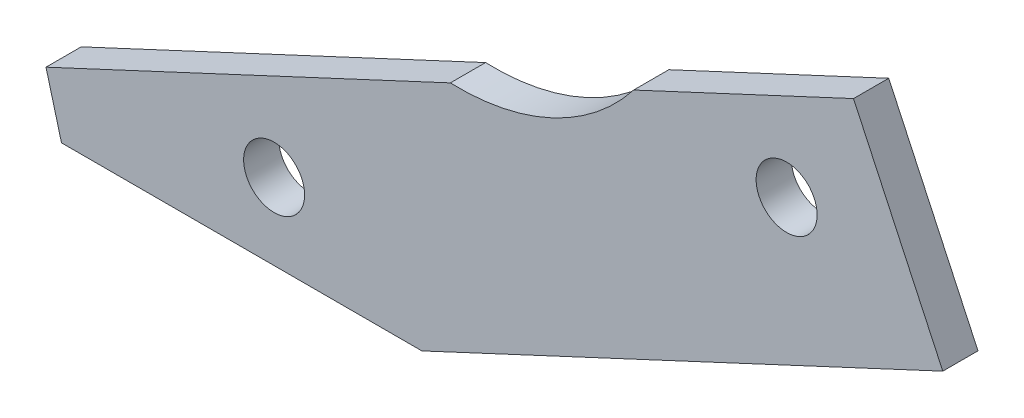
ISO-10303-21;
HEADER;
FILE_DESCRIPTION(('STEP AP214'),'2;1');
FILE_NAME('part.step','',(''),(''),'','','');
FILE_SCHEMA(('AUTOMOTIVE_DESIGN { 1 0 10303 214 1 1 1 1 }'));
ENDSEC;
DATA;
#1=APPLICATION_CONTEXT('core data for automotive mechanical design processes');
#2=APPLICATION_PROTOCOL_DEFINITION('international standard','automotive_design',2000,#1);
#3=PRODUCT_CONTEXT('',#1,'mechanical');
#4=PRODUCT('Part','Part','',(#3));
#5=PRODUCT_RELATED_PRODUCT_CATEGORY('part','',(#4));
#6=PRODUCT_DEFINITION_FORMATION('','',#4);
#7=PRODUCT_DEFINITION_CONTEXT('part definition',#1,'design');
#8=PRODUCT_DEFINITION('design','',#6,#7);
#9=PRODUCT_DEFINITION_SHAPE('','',#8);
#10=(LENGTH_UNIT() NAMED_UNIT(*) SI_UNIT(.MILLI.,.METRE.));
#11=(NAMED_UNIT(*) PLANE_ANGLE_UNIT() SI_UNIT($,.RADIAN.));
#12=(NAMED_UNIT(*) SI_UNIT($,.STERADIAN.) SOLID_ANGLE_UNIT());
#13=UNCERTAINTY_MEASURE_WITH_UNIT(LENGTH_MEASURE(1.E-05),#10,'distance_accuracy_value','');
#14=(GEOMETRIC_REPRESENTATION_CONTEXT(3) GLOBAL_UNCERTAINTY_ASSIGNED_CONTEXT((#13)) GLOBAL_UNIT_ASSIGNED_CONTEXT((#10,
#11,#12)) REPRESENTATION_CONTEXT('',''));
#15=CARTESIAN_POINT('',(0.,0.,0.));
#16=DIRECTION('',(0.,0.,1.));
#17=DIRECTION('',(1.,0.,0.));
#18=AXIS2_PLACEMENT_3D('',#15,#16,#17);
#19=CARTESIAN_POINT('',(-143.336488127854,145.681801447303,-3.175));
#20=DIRECTION('',(0.90630778703665,0.4226182617407,0.));
#21=DIRECTION('',(-0.4226182617407,0.90630778703665,0.));
#22=AXIS2_PLACEMENT_3D('',#19,#20,#21);
#23=PLANE('',#22);
#24=DIRECTION('',(-0.4226182617407,0.90630778703665,0.));
#25=VECTOR('',#24,1.);
#26=CARTESIAN_POINT('',(-143.336488127854,145.681801447303,0.));
#27=LINE('',#26,#25);
#28=CARTESIAN_POINT('',(-143.336488127854,145.681801447303,0.));
#29=VERTEX_POINT('',#28);
#30=CARTESIAN_POINT('',(-151.387366014014,162.946964790352,0.));
#31=VERTEX_POINT('',#30);
#32=EDGE_CURVE('E132',#29,#31,#27,.T.);
#33=ORIENTED_EDGE('',*,*,#32,.F.);
#34=DIRECTION('',(0.,0.,1.));
#35=VECTOR('',#34,1.);
#36=CARTESIAN_POINT('',(-143.336488127854,145.681801447303,-3.175));
#37=LINE('',#36,#35);
#38=CARTESIAN_POINT('',(-143.336488127854,145.681801447303,-3.175));
#39=VERTEX_POINT('',#38);
#40=EDGE_CURVE('E11',#39,#29,#37,.T.);
#41=ORIENTED_EDGE('',*,*,#40,.F.);
#42=DIRECTION('',(-0.4226182617407,0.90630778703665,0.));
#43=VECTOR('',#42,1.);
#44=CARTESIAN_POINT('',(-143.336488127854,145.681801447303,-3.175));
#45=LINE('',#44,#43);
#46=CARTESIAN_POINT('',(-151.387366014014,162.946964790352,-3.175));
#47=VERTEX_POINT('',#46);
#48=EDGE_CURVE('E150',#39,#47,#45,.T.);
#49=ORIENTED_EDGE('',*,*,#48,.T.);
#50=DIRECTION('',(0.,0.,1.));
#51=VECTOR('',#50,1.);
#52=CARTESIAN_POINT('',(-151.387366014014,162.946964790352,-3.175));
#53=LINE('',#52,#51);
#54=EDGE_CURVE('E44',#47,#31,#53,.T.);
#55=ORIENTED_EDGE('',*,*,#54,.T.);
#56=EDGE_LOOP('',(#33,#41,#49,#55));
#57=FACE_BOUND('',#56,.T.);
#58=ADVANCED_FACE('F41',(#57),#23,.T.);
#59=CARTESIAN_POINT('',(-190.317469649379,123.774209976178,-3.175));
#60=DIRECTION('',(0.4226182617407,-0.90630778703665,0.));
#61=DIRECTION('',(0.90630778703665,0.4226182617407,0.));
#62=AXIS2_PLACEMENT_3D('',#59,#60,#61);
#63=PLANE('',#62);
#64=DIRECTION('',(0.90630778703665,0.4226182617407,0.));
#65=VECTOR('',#64,1.);
#66=CARTESIAN_POINT('',(-190.317469649379,123.774209976178,0.));
#67=LINE('',#66,#65);
#68=CARTESIAN_POINT('',(-190.317469649379,123.774209976178,0.));
#69=VERTEX_POINT('',#68);
#70=EDGE_CURVE('E148',#69,#29,#67,.T.);
#71=ORIENTED_EDGE('',*,*,#70,.F.);
#72=DIRECTION('',(0.,0.,1.));
#73=VECTOR('',#72,1.);
#74=CARTESIAN_POINT('',(-190.317469649379,123.774209976178,-3.175));
#75=LINE('',#74,#73);
#76=CARTESIAN_POINT('',(-190.317469649379,123.774209976178,-3.175));
#77=VERTEX_POINT('',#76);
#78=EDGE_CURVE('E50',#77,#69,#75,.T.);
#79=ORIENTED_EDGE('',*,*,#78,.F.);
#80=DIRECTION('',(0.90630778703665,0.4226182617407,0.));
#81=VECTOR('',#80,1.);
#82=CARTESIAN_POINT('',(-190.317469649379,123.774209976178,-3.175));
#83=LINE('',#82,#81);
#84=EDGE_CURVE('E122',#77,#39,#83,.T.);
#85=ORIENTED_EDGE('',*,*,#84,.T.);
#86=ORIENTED_EDGE('',*,*,#40,.T.);
#87=EDGE_LOOP('',(#71,#79,#85,#86));
#88=FACE_BOUND('',#87,.T.);
#89=ADVANCED_FACE('F160',(#88),#63,.T.);
#90=CARTESIAN_POINT('',(-222.816572263279,123.774209976178,-3.175));
#91=DIRECTION('',(0.,-1.,0.));
#92=DIRECTION('',(0.,0.,-1.));
#93=AXIS2_PLACEMENT_3D('',#90,#91,#92);
#94=PLANE('',#93);
#95=DIRECTION('',(1.,0.,0.));
#96=VECTOR('',#95,1.);
#97=CARTESIAN_POINT('',(-222.816572263279,123.774209976178,0.));
#98=LINE('',#97,#96);
#99=CARTESIAN_POINT('',(-222.816572263279,123.774209976178,0.));
#100=VERTEX_POINT('',#99);
#101=EDGE_CURVE('E109',#100,#69,#98,.T.);
#102=ORIENTED_EDGE('',*,*,#101,.F.);
#103=DIRECTION('',(0.,0.,1.));
#104=VECTOR('',#103,1.);
#105=CARTESIAN_POINT('',(-222.816572263279,123.774209976178,-3.175));
#106=LINE('',#105,#104);
#107=CARTESIAN_POINT('',(-222.816572263279,123.774209976178,-3.175));
#108=VERTEX_POINT('',#107);
#109=EDGE_CURVE('E104',#108,#100,#106,.T.);
#110=ORIENTED_EDGE('',*,*,#109,.F.);
#111=DIRECTION('',(1.,0.,0.));
#112=VECTOR('',#111,1.);
#113=CARTESIAN_POINT('',(-222.816572263279,123.774209976178,-3.175));
#114=LINE('',#113,#112);
#115=EDGE_CURVE('E107',#108,#77,#114,.T.);
#116=ORIENTED_EDGE('',*,*,#115,.T.);
#117=ORIENTED_EDGE('',*,*,#78,.T.);
#118=EDGE_LOOP('',(#102,#110,#116,#117));
#119=FACE_BOUND('',#118,.T.);
#120=ADVANCED_FACE('F106',(#119),#94,.T.);
#121=CARTESIAN_POINT('',(-224.213491790778,128.987584626888,-3.175));
#122=DIRECTION('',(-0.96592582628907,-0.258819045102514,0.));
#123=DIRECTION('',(0.258819045102514,-0.96592582628907,0.));
#124=AXIS2_PLACEMENT_3D('',#121,#122,#123);
#125=PLANE('',#124);
#126=DIRECTION('',(0.258819045102514,-0.96592582628907,0.));
#127=VECTOR('',#126,1.);
#128=CARTESIAN_POINT('',(-224.213491790778,128.987584626888,0.));
#129=LINE('',#128,#127);
#130=CARTESIAN_POINT('',(-224.213491790778,128.987584626888,0.));
#131=VERTEX_POINT('',#130);
#132=EDGE_CURVE('E145',#131,#100,#129,.T.);
#133=ORIENTED_EDGE('',*,*,#132,.F.);
#134=DIRECTION('',(0.,0.,1.));
#135=VECTOR('',#134,1.);
#136=CARTESIAN_POINT('',(-224.213491790778,128.987584626888,-3.175));
#137=LINE('',#136,#135);
#138=CARTESIAN_POINT('',(-224.213491790778,128.987584626888,-3.175));
#139=VERTEX_POINT('',#138);
#140=EDGE_CURVE('E114',#139,#131,#137,.T.);
#141=ORIENTED_EDGE('',*,*,#140,.F.);
#142=DIRECTION('',(0.258819045102514,-0.96592582628907,0.));
#143=VECTOR('',#142,1.);
#144=CARTESIAN_POINT('',(-224.213491790778,128.987584626888,-3.175));
#145=LINE('',#144,#143);
#146=EDGE_CURVE('E120',#139,#108,#145,.T.);
#147=ORIENTED_EDGE('',*,*,#146,.T.);
#148=ORIENTED_EDGE('',*,*,#109,.T.);
#149=EDGE_LOOP('',(#133,#141,#147,#148));
#150=FACE_BOUND('',#149,.T.);
#151=ADVANCED_FACE('F124',(#150),#125,.T.);
#152=CARTESIAN_POINT('',(-187.747718892805,145.991853789753,-3.175));
#153=DIRECTION('',(-0.4226182617407,0.906307787036649,0.));
#154=DIRECTION('',(-0.90630778703665,-0.4226182617407,0.));
#155=AXIS2_PLACEMENT_3D('',#152,#153,#154);
#156=PLANE('',#155);
#157=DIRECTION('',(-0.906307787036649,-0.4226182617407,0.));
#158=VECTOR('',#157,1.);
#159=CARTESIAN_POINT('',(-187.747718892805,145.991853789753,0.));
#160=LINE('',#159,#158);
#161=CARTESIAN_POINT('',(-187.747718892805,145.991853789753,0.));
#162=VERTEX_POINT('',#161);
#163=EDGE_CURVE('E142',#162,#131,#160,.T.);
#164=ORIENTED_EDGE('',*,*,#163,.F.);
#165=DIRECTION('',(0.,0.,1.));
#166=VECTOR('',#165,1.);
#167=CARTESIAN_POINT('',(-187.747718892805,145.991853789753,-3.175));
#168=LINE('',#167,#166);
#169=CARTESIAN_POINT('',(-187.747718892805,145.991853789753,-3.175));
#170=VERTEX_POINT('',#169);
#171=EDGE_CURVE('E154',#170,#162,#168,.T.);
#172=ORIENTED_EDGE('',*,*,#171,.F.);
#173=DIRECTION('',(-0.906307787036649,-0.4226182617407,0.));
#174=VECTOR('',#173,1.);
#175=CARTESIAN_POINT('',(-187.747718892805,145.991853789753,-3.175));
#176=LINE('',#175,#174);
#177=EDGE_CURVE('E125',#170,#139,#176,.T.);
#178=ORIENTED_EDGE('',*,*,#177,.T.);
#179=ORIENTED_EDGE('',*,*,#140,.T.);
#180=EDGE_LOOP('',(#164,#172,#178,#179));
#181=FACE_BOUND('',#180,.T.);
#182=ADVANCED_FACE('F173',(#181),#156,.T.);
#183=CARTESIAN_POINT('',(-187.005512471135,165.978077285642,-3.175));
#184=DIRECTION('',(0.,0.,1.));
#185=DIRECTION('',(1.,0.,0.));
#186=AXIS2_PLACEMENT_3D('',#183,#184,#185);
#187=CYLINDRICAL_SURFACE('',#186,20.);
#188=CARTESIAN_POINT('',(-187.005512471135,165.978077285642,0.));
#189=DIRECTION('',(0.,0.,-1.));
#190=DIRECTION('',(-1.,0.,0.));
#191=AXIS2_PLACEMENT_3D('',#188,#189,#190);
#192=CIRCLE('',#191,20.);
#193=CARTESIAN_POINT('',(-171.218095931495,153.699743563027,0.));
#194=VERTEX_POINT('',#193);
#195=EDGE_CURVE('E139',#194,#162,#192,.T.);
#196=ORIENTED_EDGE('',*,*,#195,.F.);
#197=DIRECTION('',(0.,0.,1.));
#198=VECTOR('',#197,1.);
#199=CARTESIAN_POINT('',(-171.218095931495,153.699743563027,-3.175));
#200=LINE('',#199,#198);
#201=CARTESIAN_POINT('',(-171.218095931495,153.699743563027,-3.175));
#202=VERTEX_POINT('',#201);
#203=EDGE_CURVE('E155',#202,#194,#200,.T.);
#204=ORIENTED_EDGE('',*,*,#203,.F.);
#205=CARTESIAN_POINT('',(-187.005512471135,165.978077285642,-3.175));
#206=DIRECTION('',(0.,0.,-1.));
#207=DIRECTION('',(-1.,0.,0.));
#208=AXIS2_PLACEMENT_3D('',#205,#206,#207);
#209=CIRCLE('',#208,20.);
#210=EDGE_CURVE('E127',#202,#170,#209,.T.);
#211=ORIENTED_EDGE('',*,*,#210,.T.);
#212=ORIENTED_EDGE('',*,*,#171,.T.);
#213=EDGE_LOOP('',(#196,#204,#211,#212));
#214=FACE_BOUND('',#213,.T.);
#215=ADVANCED_FACE('F176',(#214),#187,.F.);
#216=CARTESIAN_POINT('',(-151.387366014014,162.946964790352,-3.175));
#217=DIRECTION('',(-0.422618261740699,0.90630778703665,0.));
#218=DIRECTION('',(-0.90630778703665,-0.422618261740699,0.));
#219=AXIS2_PLACEMENT_3D('',#216,#217,#218);
#220=PLANE('',#219);
#221=DIRECTION('',(-0.90630778703665,-0.422618261740699,0.));
#222=VECTOR('',#221,1.);
#223=CARTESIAN_POINT('',(-151.387366014014,162.946964790352,0.));
#224=LINE('',#223,#222);
#225=EDGE_CURVE('E135',#31,#194,#224,.T.);
#226=ORIENTED_EDGE('',*,*,#225,.F.);
#227=ORIENTED_EDGE('',*,*,#54,.F.);
#228=DIRECTION('',(-0.90630778703665,-0.422618261740699,0.));
#229=VECTOR('',#228,1.);
#230=CARTESIAN_POINT('',(-151.387366014014,162.946964790352,-3.175));
#231=LINE('',#230,#229);
#232=EDGE_CURVE('E216',#47,#202,#231,.T.);
#233=ORIENTED_EDGE('',*,*,#232,.T.);
#234=ORIENTED_EDGE('',*,*,#203,.T.);
#235=EDGE_LOOP('',(#226,#227,#233,#234));
#236=FACE_BOUND('',#235,.T.);
#237=ADVANCED_FACE('F157',(#236),#220,.T.);
#238=CARTESIAN_POINT('',(-187.005512471135,165.978077285642,-3.175));
#239=DIRECTION('',(0.,0.,-1.));
#240=DIRECTION('',(-1.,0.,0.));
#241=AXIS2_PLACEMENT_3D('',#238,#239,#240);
#242=PLANE('',#241);
#243=CARTESIAN_POINT('',(-157.419347359778,152.220574699201,-3.175));
#244=DIRECTION('',(0.,0.,1.));
#245=DIRECTION('',(1.,0.,0.));
#246=AXIS2_PLACEMENT_3D('',#243,#244,#245);
#247=CIRCLE('',#246,2.74999999999973);
#248=CARTESIAN_POINT('',(-154.669347359778,152.220574699201,-3.175));
#249=VERTEX_POINT('',#248);
#250=EDGE_CURVE('E203',#249,#249,#247,.T.);
#251=ORIENTED_EDGE('',*,*,#250,.T.);
#252=EDGE_LOOP('',(#251));
#253=FACE_BOUND('',#252,.T.);
#254=CARTESIAN_POINT('',(-203.641044498646,130.667043350425,-3.175));
#255=DIRECTION('',(0.,0.,1.));
#256=DIRECTION('',(1.,0.,0.));
#257=AXIS2_PLACEMENT_3D('',#254,#255,#256);
#258=CIRCLE('',#257,2.7499999999997);
#259=CARTESIAN_POINT('',(-200.891044498646,130.667043350425,-3.175));
#260=VERTEX_POINT('',#259);
#261=EDGE_CURVE('E136',#260,#260,#258,.T.);
#262=ORIENTED_EDGE('',*,*,#261,.T.);
#263=EDGE_LOOP('',(#262));
#264=FACE_BOUND('',#263,.T.);
#265=ORIENTED_EDGE('',*,*,#48,.F.);
#266=ORIENTED_EDGE('',*,*,#84,.F.);
#267=ORIENTED_EDGE('',*,*,#115,.F.);
#268=ORIENTED_EDGE('',*,*,#146,.F.);
#269=ORIENTED_EDGE('',*,*,#177,.F.);
#270=ORIENTED_EDGE('',*,*,#210,.F.);
#271=ORIENTED_EDGE('',*,*,#232,.F.);
#272=EDGE_LOOP('',(#265,#266,#267,#268,#269,#270,#271));
#273=FACE_BOUND('',#272,.T.);
#274=ADVANCED_FACE('F118',(#253,#264,#273),#242,.T.);
#275=CARTESIAN_POINT('',(-187.005512471135,165.978077285642,0.));
#276=DIRECTION('',(0.,0.,-1.));
#277=DIRECTION('',(-1.,0.,0.));
#278=AXIS2_PLACEMENT_3D('',#275,#276,#277);
#279=PLANE('',#278);
#280=CARTESIAN_POINT('',(-157.419347359778,152.220574699201,0.));
#281=DIRECTION('',(0.,0.,1.));
#282=DIRECTION('',(1.,0.,0.));
#283=AXIS2_PLACEMENT_3D('',#280,#281,#282);
#284=CIRCLE('',#283,2.74999999999973);
#285=CARTESIAN_POINT('',(-154.669347359778,152.220574699201,0.));
#286=VERTEX_POINT('',#285);
#287=EDGE_CURVE('E206',#286,#286,#284,.T.);
#288=ORIENTED_EDGE('',*,*,#287,.F.);
#289=EDGE_LOOP('',(#288));
#290=FACE_BOUND('',#289,.T.);
#291=CARTESIAN_POINT('',(-203.641044498646,130.667043350425,0.));
#292=DIRECTION('',(0.,0.,1.));
#293=DIRECTION('',(1.,0.,0.));
#294=AXIS2_PLACEMENT_3D('',#291,#292,#293);
#295=CIRCLE('',#294,2.7499999999997);
#296=CARTESIAN_POINT('',(-200.891044498646,130.667043350425,0.));
#297=VERTEX_POINT('',#296);
#298=EDGE_CURVE('E208',#297,#297,#295,.T.);
#299=ORIENTED_EDGE('',*,*,#298,.F.);
#300=EDGE_LOOP('',(#299));
#301=FACE_BOUND('',#300,.T.);
#302=ORIENTED_EDGE('',*,*,#32,.T.);
#303=ORIENTED_EDGE('',*,*,#225,.T.);
#304=ORIENTED_EDGE('',*,*,#195,.T.);
#305=ORIENTED_EDGE('',*,*,#163,.T.);
#306=ORIENTED_EDGE('',*,*,#132,.T.);
#307=ORIENTED_EDGE('',*,*,#101,.T.);
#308=ORIENTED_EDGE('',*,*,#70,.T.);
#309=EDGE_LOOP('',(#302,#303,#304,#305,#306,#307,#308));
#310=FACE_BOUND('',#309,.T.);
#311=ADVANCED_FACE('F159',(#290,#301,#310),#279,.F.);
#312=CARTESIAN_POINT('',(-203.641044498646,130.667043350425,-3.175));
#313=DIRECTION('',(0.,0.,1.));
#314=DIRECTION('',(1.,0.,0.));
#315=AXIS2_PLACEMENT_3D('',#312,#313,#314);
#316=CYLINDRICAL_SURFACE('',#315,2.7499999999997);
#317=ORIENTED_EDGE('',*,*,#261,.F.);
#318=EDGE_LOOP('',(#317));
#319=FACE_BOUND('',#318,.T.);
#320=ORIENTED_EDGE('',*,*,#298,.T.);
#321=EDGE_LOOP('',(#320));
#322=FACE_BOUND('',#321,.T.);
#323=ADVANCED_FACE('F188',(#319,#322),#316,.F.);
#324=CARTESIAN_POINT('',(-157.419347359778,152.220574699201,-3.175));
#325=DIRECTION('',(0.,0.,1.));
#326=DIRECTION('',(1.,0.,0.));
#327=AXIS2_PLACEMENT_3D('',#324,#325,#326);
#328=CYLINDRICAL_SURFACE('',#327,2.74999999999973);
#329=ORIENTED_EDGE('',*,*,#250,.F.);
#330=EDGE_LOOP('',(#329));
#331=FACE_BOUND('',#330,.T.);
#332=ORIENTED_EDGE('',*,*,#287,.T.);
#333=EDGE_LOOP('',(#332));
#334=FACE_BOUND('',#333,.T.);
#335=ADVANCED_FACE('F195',(#331,#334),#328,.F.);
#336=CLOSED_SHELL('',(#58,#89,#120,#151,#182,#215,#237,#274,#311,#323,#335));
#337=MANIFOLD_SOLID_BREP('B2',#336);
#338=ADVANCED_BREP_SHAPE_REPRESENTATION('',(#18,#337),#14);
#339=SHAPE_DEFINITION_REPRESENTATION(#9,#338);
ENDSEC;
END-ISO-10303-21;
